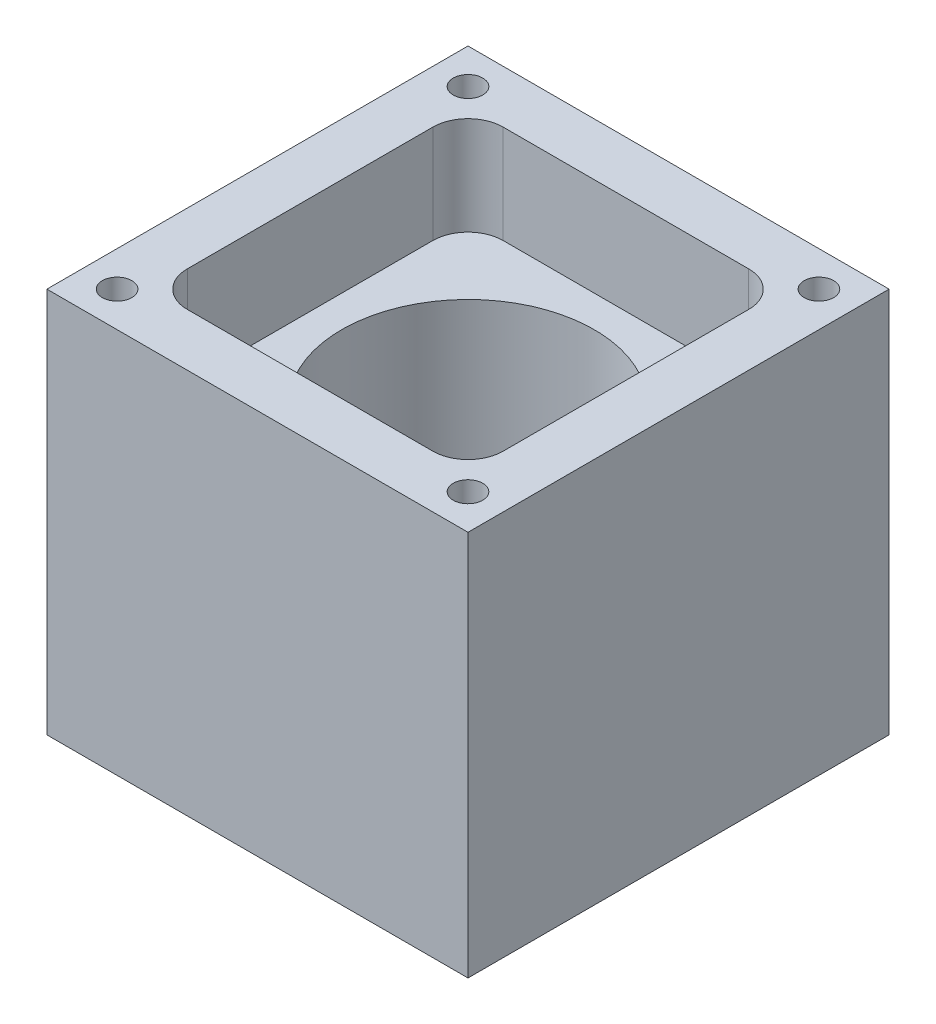
ISO-10303-21;
HEADER;
FILE_DESCRIPTION(('STEP AP214'),'2;1');
FILE_NAME('part.step','',(''),(''),'','','');
FILE_SCHEMA(('AUTOMOTIVE_DESIGN { 1 0 10303 214 1 1 1 1 }'));
ENDSEC;
DATA;
#1=APPLICATION_CONTEXT('core data for automotive mechanical design processes');
#2=APPLICATION_PROTOCOL_DEFINITION('international standard','automotive_design',2000,#1);
#3=PRODUCT_CONTEXT('',#1,'mechanical');
#4=PRODUCT('Part','Part','',(#3));
#5=PRODUCT_RELATED_PRODUCT_CATEGORY('part','',(#4));
#6=PRODUCT_DEFINITION_FORMATION('','',#4);
#7=PRODUCT_DEFINITION_CONTEXT('part definition',#1,'design');
#8=PRODUCT_DEFINITION('design','',#6,#7);
#9=PRODUCT_DEFINITION_SHAPE('','',#8);
#10=(LENGTH_UNIT() NAMED_UNIT(*) SI_UNIT(.MILLI.,.METRE.));
#11=(NAMED_UNIT(*) PLANE_ANGLE_UNIT() SI_UNIT($,.RADIAN.));
#12=(NAMED_UNIT(*) SI_UNIT($,.STERADIAN.) SOLID_ANGLE_UNIT());
#13=UNCERTAINTY_MEASURE_WITH_UNIT(LENGTH_MEASURE(1.E-05),#10,'distance_accuracy_value','');
#14=(GEOMETRIC_REPRESENTATION_CONTEXT(3) GLOBAL_UNCERTAINTY_ASSIGNED_CONTEXT((#13)) GLOBAL_UNIT_ASSIGNED_CONTEXT((#10,
#11,#12)) REPRESENTATION_CONTEXT('',''));
#15=CARTESIAN_POINT('',(0.,0.,0.));
#16=DIRECTION('',(0.,0.,1.));
#17=DIRECTION('',(1.,0.,0.));
#18=AXIS2_PLACEMENT_3D('',#15,#16,#17);
#19=CARTESIAN_POINT('',(0.,0.,0.));
#20=DIRECTION('',(0.,1.,0.));
#21=DIRECTION('',(0.,0.,1.));
#22=AXIS2_PLACEMENT_3D('',#19,#20,#21);
#23=CYLINDRICAL_SURFACE('',#22,18.);
#24=CARTESIAN_POINT('',(0.,0.,0.));
#25=DIRECTION('',(0.,1.,0.));
#26=DIRECTION('',(0.,0.,1.));
#27=AXIS2_PLACEMENT_3D('',#24,#25,#26);
#28=CIRCLE('',#27,18.);
#29=CARTESIAN_POINT('',(0.,0.,18.));
#30=VERTEX_POINT('',#29);
#31=EDGE_CURVE('E257',#30,#30,#28,.T.);
#32=ORIENTED_EDGE('',*,*,#31,.F.);
#33=EDGE_LOOP('',(#32));
#34=FACE_BOUND('',#33,.T.);
#35=CARTESIAN_POINT('',(0.,41.,0.));
#36=DIRECTION('',(0.,1.,0.));
#37=DIRECTION('',(0.,0.,1.));
#38=AXIS2_PLACEMENT_3D('',#35,#36,#37);
#39=CIRCLE('',#38,18.);
#40=CARTESIAN_POINT('',(0.,41.,18.));
#41=VERTEX_POINT('',#40);
#42=EDGE_CURVE('E161',#41,#41,#39,.F.);
#43=ORIENTED_EDGE('',*,*,#42,.F.);
#44=EDGE_LOOP('',(#43));
#45=FACE_BOUND('',#44,.T.);
#46=ADVANCED_FACE('F40',(#34,#45),#23,.F.);
#47=CARTESIAN_POINT('',(-30.,55.,30.));
#48=DIRECTION('',(1.,0.,0.));
#49=DIRECTION('',(0.,0.,-1.));
#50=AXIS2_PLACEMENT_3D('',#47,#48,#49);
#51=PLANE('',#50);
#52=DIRECTION('',(0.,0.,1.));
#53=VECTOR('',#52,1.);
#54=CARTESIAN_POINT('',(-30.,0.,30.));
#55=LINE('',#54,#53);
#56=CARTESIAN_POINT('',(-30.,0.,-30.));
#57=VERTEX_POINT('',#56);
#58=CARTESIAN_POINT('',(-30.,0.,30.));
#59=VERTEX_POINT('',#58);
#60=EDGE_CURVE('E152',#57,#59,#55,.T.);
#61=ORIENTED_EDGE('',*,*,#60,.T.);
#62=DIRECTION('',(0.,-1.,0.));
#63=VECTOR('',#62,1.);
#64=CARTESIAN_POINT('',(-30.,55.,30.));
#65=LINE('',#64,#63);
#66=CARTESIAN_POINT('',(-30.,55.,30.));
#67=VERTEX_POINT('',#66);
#68=EDGE_CURVE('E132',#67,#59,#65,.T.);
#69=ORIENTED_EDGE('',*,*,#68,.F.);
#70=DIRECTION('',(0.,0.,1.));
#71=VECTOR('',#70,1.);
#72=CARTESIAN_POINT('',(-30.,55.,30.));
#73=LINE('',#72,#71);
#74=CARTESIAN_POINT('',(-30.,55.,-30.));
#75=VERTEX_POINT('',#74);
#76=EDGE_CURVE('E139',#75,#67,#73,.T.);
#77=ORIENTED_EDGE('',*,*,#76,.F.);
#78=DIRECTION('',(0.,-1.,0.));
#79=VECTOR('',#78,1.);
#80=CARTESIAN_POINT('',(-30.,55.,-30.));
#81=LINE('',#80,#79);
#82=EDGE_CURVE('E262',#75,#57,#81,.T.);
#83=ORIENTED_EDGE('',*,*,#82,.T.);
#84=EDGE_LOOP('',(#61,#69,#77,#83));
#85=FACE_BOUND('',#84,.T.);
#86=ADVANCED_FACE('F150',(#85),#51,.F.);
#87=CARTESIAN_POINT('',(30.,55.,30.));
#88=DIRECTION('',(0.,0.,-1.));
#89=DIRECTION('',(-1.,0.,0.));
#90=AXIS2_PLACEMENT_3D('',#87,#88,#89);
#91=PLANE('',#90);
#92=DIRECTION('',(1.,0.,0.));
#93=VECTOR('',#92,1.);
#94=CARTESIAN_POINT('',(30.,0.,30.));
#95=LINE('',#94,#93);
#96=CARTESIAN_POINT('',(30.,0.,30.));
#97=VERTEX_POINT('',#96);
#98=EDGE_CURVE('E264',#59,#97,#95,.T.);
#99=ORIENTED_EDGE('',*,*,#98,.T.);
#100=DIRECTION('',(0.,-1.,0.));
#101=VECTOR('',#100,1.);
#102=CARTESIAN_POINT('',(30.,55.,30.));
#103=LINE('',#102,#101);
#104=CARTESIAN_POINT('',(30.,55.,30.));
#105=VERTEX_POINT('',#104);
#106=EDGE_CURVE('E135',#105,#97,#103,.T.);
#107=ORIENTED_EDGE('',*,*,#106,.F.);
#108=DIRECTION('',(1.,0.,0.));
#109=VECTOR('',#108,1.);
#110=CARTESIAN_POINT('',(30.,55.,30.));
#111=LINE('',#110,#109);
#112=EDGE_CURVE('E128',#67,#105,#111,.T.);
#113=ORIENTED_EDGE('',*,*,#112,.F.);
#114=ORIENTED_EDGE('',*,*,#68,.T.);
#115=EDGE_LOOP('',(#99,#107,#113,#114));
#116=FACE_BOUND('',#115,.T.);
#117=ADVANCED_FACE('F130',(#116),#91,.F.);
#118=CARTESIAN_POINT('',(30.,55.,30.));
#119=DIRECTION('',(-1.,0.,0.));
#120=DIRECTION('',(0.,0.,1.));
#121=AXIS2_PLACEMENT_3D('',#118,#119,#120);
#122=PLANE('',#121);
#123=DIRECTION('',(0.,0.,-1.));
#124=VECTOR('',#123,1.);
#125=CARTESIAN_POINT('',(30.,0.,30.));
#126=LINE('',#125,#124);
#127=CARTESIAN_POINT('',(30.,0.,-30.));
#128=VERTEX_POINT('',#127);
#129=EDGE_CURVE('E266',#97,#128,#126,.T.);
#130=ORIENTED_EDGE('',*,*,#129,.T.);
#131=DIRECTION('',(0.,-1.,0.));
#132=VECTOR('',#131,1.);
#133=CARTESIAN_POINT('',(30.,55.,-30.));
#134=LINE('',#133,#132);
#135=CARTESIAN_POINT('',(30.,55.,-30.));
#136=VERTEX_POINT('',#135);
#137=EDGE_CURVE('E157',#136,#128,#134,.T.);
#138=ORIENTED_EDGE('',*,*,#137,.F.);
#139=DIRECTION('',(0.,0.,-1.));
#140=VECTOR('',#139,1.);
#141=CARTESIAN_POINT('',(30.,55.,30.));
#142=LINE('',#141,#140);
#143=EDGE_CURVE('E138',#105,#136,#142,.T.);
#144=ORIENTED_EDGE('',*,*,#143,.F.);
#145=ORIENTED_EDGE('',*,*,#106,.T.);
#146=EDGE_LOOP('',(#130,#138,#144,#145));
#147=FACE_BOUND('',#146,.T.);
#148=ADVANCED_FACE('F278',(#147),#122,.F.);
#149=CARTESIAN_POINT('',(30.,55.,-30.));
#150=DIRECTION('',(0.,0.,1.));
#151=DIRECTION('',(1.,0.,0.));
#152=AXIS2_PLACEMENT_3D('',#149,#150,#151);
#153=PLANE('',#152);
#154=DIRECTION('',(-1.,0.,0.));
#155=VECTOR('',#154,1.);
#156=CARTESIAN_POINT('',(30.,0.,-30.));
#157=LINE('',#156,#155);
#158=EDGE_CURVE('E148',#128,#57,#157,.T.);
#159=ORIENTED_EDGE('',*,*,#158,.T.);
#160=ORIENTED_EDGE('',*,*,#82,.F.);
#161=DIRECTION('',(-1.,0.,0.));
#162=VECTOR('',#161,1.);
#163=CARTESIAN_POINT('',(30.,55.,-30.));
#164=LINE('',#163,#162);
#165=EDGE_CURVE('E144',#136,#75,#164,.T.);
#166=ORIENTED_EDGE('',*,*,#165,.F.);
#167=ORIENTED_EDGE('',*,*,#137,.T.);
#168=EDGE_LOOP('',(#159,#160,#166,#167));
#169=FACE_BOUND('',#168,.T.);
#170=ADVANCED_FACE('F273',(#169),#153,.F.);
#171=CARTESIAN_POINT('',(0.,55.,0.));
#172=DIRECTION('',(0.,1.,0.));
#173=DIRECTION('',(0.,0.,1.));
#174=AXIS2_PLACEMENT_3D('',#171,#172,#173);
#175=PLANE('',#174);
#176=DIRECTION('',(0.,0.,1.));
#177=VECTOR('',#176,1.);
#178=CARTESIAN_POINT('',(-22.5,55.,22.5));
#179=LINE('',#178,#177);
#180=CARTESIAN_POINT('',(-22.5,55.,-17.5));
#181=VERTEX_POINT('',#180);
#182=CARTESIAN_POINT('',(-22.5,55.,17.5));
#183=VERTEX_POINT('',#182);
#184=EDGE_CURVE('E207',#181,#183,#179,.T.);
#185=ORIENTED_EDGE('',*,*,#184,.F.);
#186=CARTESIAN_POINT('',(-17.5,55.,-17.5));
#187=DIRECTION('',(0.,1.,0.));
#188=DIRECTION('',(0.,0.,1.));
#189=AXIS2_PLACEMENT_3D('',#186,#187,#188);
#190=CIRCLE('',#189,5.);
#191=CARTESIAN_POINT('',(-17.5,55.,-22.5));
#192=VERTEX_POINT('',#191);
#193=EDGE_CURVE('E11',#181,#192,#190,.F.);
#194=ORIENTED_EDGE('',*,*,#193,.T.);
#195=DIRECTION('',(-1.,0.,0.));
#196=VECTOR('',#195,1.);
#197=CARTESIAN_POINT('',(22.5,55.,-22.5));
#198=LINE('',#197,#196);
#199=CARTESIAN_POINT('',(17.5,55.,-22.5));
#200=VERTEX_POINT('',#199);
#201=EDGE_CURVE('E231',#200,#192,#198,.T.);
#202=ORIENTED_EDGE('',*,*,#201,.F.);
#203=CARTESIAN_POINT('',(17.5,55.,-17.5));
#204=DIRECTION('',(0.,1.,0.));
#205=DIRECTION('',(0.,0.,1.));
#206=AXIS2_PLACEMENT_3D('',#203,#204,#205);
#207=CIRCLE('',#206,5.);
#208=CARTESIAN_POINT('',(22.5,55.,-17.5));
#209=VERTEX_POINT('',#208);
#210=EDGE_CURVE('E190',#200,#209,#207,.F.);
#211=ORIENTED_EDGE('',*,*,#210,.T.);
#212=DIRECTION('',(0.,0.,-1.));
#213=VECTOR('',#212,1.);
#214=CARTESIAN_POINT('',(22.5,55.,22.5));
#215=LINE('',#214,#213);
#216=CARTESIAN_POINT('',(22.5,55.,17.5));
#217=VERTEX_POINT('',#216);
#218=EDGE_CURVE('E198',#217,#209,#215,.T.);
#219=ORIENTED_EDGE('',*,*,#218,.F.);
#220=CARTESIAN_POINT('',(17.5,55.,17.5));
#221=DIRECTION('',(0.,1.,0.));
#222=DIRECTION('',(0.,0.,1.));
#223=AXIS2_PLACEMENT_3D('',#220,#221,#222);
#224=CIRCLE('',#223,5.);
#225=CARTESIAN_POINT('',(17.5,55.,22.5));
#226=VERTEX_POINT('',#225);
#227=EDGE_CURVE('E192',#217,#226,#224,.F.);
#228=ORIENTED_EDGE('',*,*,#227,.T.);
#229=DIRECTION('',(1.,0.,0.));
#230=VECTOR('',#229,1.);
#231=CARTESIAN_POINT('',(22.5,55.,22.5));
#232=LINE('',#231,#230);
#233=CARTESIAN_POINT('',(-17.5,55.,22.5));
#234=VERTEX_POINT('',#233);
#235=EDGE_CURVE('E196',#234,#226,#232,.T.);
#236=ORIENTED_EDGE('',*,*,#235,.F.);
#237=CARTESIAN_POINT('',(-17.5,55.,17.5));
#238=DIRECTION('',(0.,1.,0.));
#239=DIRECTION('',(0.,0.,1.));
#240=AXIS2_PLACEMENT_3D('',#237,#238,#239);
#241=CIRCLE('',#240,5.);
#242=EDGE_CURVE('E48',#234,#183,#241,.F.);
#243=ORIENTED_EDGE('',*,*,#242,.T.);
#244=EDGE_LOOP('',(#185,#194,#202,#211,#219,#228,#236,#243));
#245=FACE_BOUND('',#244,.T.);
#246=CARTESIAN_POINT('',(-25.,55.,25.));
#247=DIRECTION('',(0.,1.,0.));
#248=DIRECTION('',(0.,0.,1.));
#249=AXIS2_PLACEMENT_3D('',#246,#247,#248);
#250=CIRCLE('',#249,2.09999999999999);
#251=CARTESIAN_POINT('',(-25.,55.,27.1));
#252=VERTEX_POINT('',#251);
#253=EDGE_CURVE('E163',#252,#252,#250,.T.);
#254=ORIENTED_EDGE('',*,*,#253,.F.);
#255=EDGE_LOOP('',(#254));
#256=FACE_BOUND('',#255,.T.);
#257=CARTESIAN_POINT('',(-25.,55.,-25.));
#258=DIRECTION('',(0.,1.,0.));
#259=DIRECTION('',(0.,0.,1.));
#260=AXIS2_PLACEMENT_3D('',#257,#258,#259);
#261=CIRCLE('',#260,2.09999999999999);
#262=CARTESIAN_POINT('',(-25.,55.,-22.9));
#263=VERTEX_POINT('',#262);
#264=EDGE_CURVE('E239',#263,#263,#261,.T.);
#265=ORIENTED_EDGE('',*,*,#264,.F.);
#266=EDGE_LOOP('',(#265));
#267=FACE_BOUND('',#266,.T.);
#268=CARTESIAN_POINT('',(25.,55.,-25.));
#269=DIRECTION('',(0.,1.,0.));
#270=DIRECTION('',(0.,0.,1.));
#271=AXIS2_PLACEMENT_3D('',#268,#269,#270);
#272=CIRCLE('',#271,2.09999999999999);
#273=CARTESIAN_POINT('',(25.,55.,-22.9));
#274=VERTEX_POINT('',#273);
#275=EDGE_CURVE('E245',#274,#274,#272,.T.);
#276=ORIENTED_EDGE('',*,*,#275,.F.);
#277=EDGE_LOOP('',(#276));
#278=FACE_BOUND('',#277,.T.);
#279=CARTESIAN_POINT('',(25.,55.,25.));
#280=DIRECTION('',(0.,1.,0.));
#281=DIRECTION('',(0.,0.,1.));
#282=AXIS2_PLACEMENT_3D('',#279,#280,#281);
#283=CIRCLE('',#282,2.09999999999999);
#284=CARTESIAN_POINT('',(25.,55.,27.1));
#285=VERTEX_POINT('',#284);
#286=EDGE_CURVE('E251',#285,#285,#283,.T.);
#287=ORIENTED_EDGE('',*,*,#286,.F.);
#288=EDGE_LOOP('',(#287));
#289=FACE_BOUND('',#288,.T.);
#290=ORIENTED_EDGE('',*,*,#76,.T.);
#291=ORIENTED_EDGE('',*,*,#112,.T.);
#292=ORIENTED_EDGE('',*,*,#143,.T.);
#293=ORIENTED_EDGE('',*,*,#165,.T.);
#294=EDGE_LOOP('',(#290,#291,#292,#293));
#295=FACE_BOUND('',#294,.T.);
#296=ADVANCED_FACE('F142',(#245,#256,#267,#278,#289,#295),#175,.T.);
#297=CARTESIAN_POINT('',(0.,0.,0.));
#298=DIRECTION('',(0.,1.,0.));
#299=DIRECTION('',(0.,0.,1.));
#300=AXIS2_PLACEMENT_3D('',#297,#298,#299);
#301=PLANE('',#300);
#302=CARTESIAN_POINT('',(-25.,0.,25.));
#303=DIRECTION('',(0.,1.,0.));
#304=DIRECTION('',(0.,0.,1.));
#305=AXIS2_PLACEMENT_3D('',#302,#303,#304);
#306=CIRCLE('',#305,2.09999999999999);
#307=CARTESIAN_POINT('',(-25.,0.,27.1));
#308=VERTEX_POINT('',#307);
#309=EDGE_CURVE('E236',#308,#308,#306,.T.);
#310=ORIENTED_EDGE('',*,*,#309,.T.);
#311=EDGE_LOOP('',(#310));
#312=FACE_BOUND('',#311,.T.);
#313=CARTESIAN_POINT('',(-25.,0.,-25.));
#314=DIRECTION('',(0.,1.,0.));
#315=DIRECTION('',(0.,0.,1.));
#316=AXIS2_PLACEMENT_3D('',#313,#314,#315);
#317=CIRCLE('',#316,2.09999999999999);
#318=CARTESIAN_POINT('',(-25.,0.,-22.9));
#319=VERTEX_POINT('',#318);
#320=EDGE_CURVE('E242',#319,#319,#317,.T.);
#321=ORIENTED_EDGE('',*,*,#320,.T.);
#322=EDGE_LOOP('',(#321));
#323=FACE_BOUND('',#322,.T.);
#324=CARTESIAN_POINT('',(25.,0.,-25.));
#325=DIRECTION('',(0.,1.,0.));
#326=DIRECTION('',(0.,0.,1.));
#327=AXIS2_PLACEMENT_3D('',#324,#325,#326);
#328=CIRCLE('',#327,2.09999999999999);
#329=CARTESIAN_POINT('',(25.,0.,-22.9));
#330=VERTEX_POINT('',#329);
#331=EDGE_CURVE('E248',#330,#330,#328,.T.);
#332=ORIENTED_EDGE('',*,*,#331,.T.);
#333=EDGE_LOOP('',(#332));
#334=FACE_BOUND('',#333,.T.);
#335=CARTESIAN_POINT('',(25.,0.,25.));
#336=DIRECTION('',(0.,1.,0.));
#337=DIRECTION('',(0.,0.,1.));
#338=AXIS2_PLACEMENT_3D('',#335,#336,#337);
#339=CIRCLE('',#338,2.09999999999999);
#340=CARTESIAN_POINT('',(25.,0.,27.1));
#341=VERTEX_POINT('',#340);
#342=EDGE_CURVE('E254',#341,#341,#339,.T.);
#343=ORIENTED_EDGE('',*,*,#342,.T.);
#344=EDGE_LOOP('',(#343));
#345=FACE_BOUND('',#344,.T.);
#346=ORIENTED_EDGE('',*,*,#31,.T.);
#347=EDGE_LOOP('',(#346));
#348=FACE_BOUND('',#347,.T.);
#349=ORIENTED_EDGE('',*,*,#60,.F.);
#350=ORIENTED_EDGE('',*,*,#158,.F.);
#351=ORIENTED_EDGE('',*,*,#129,.F.);
#352=ORIENTED_EDGE('',*,*,#98,.F.);
#353=EDGE_LOOP('',(#349,#350,#351,#352));
#354=FACE_BOUND('',#353,.T.);
#355=ADVANCED_FACE('F277',(#312,#323,#334,#345,#348,#354),#301,.F.);
#356=CARTESIAN_POINT('',(25.,55.,25.));
#357=DIRECTION('',(0.,1.,0.));
#358=DIRECTION('',(0.,0.,1.));
#359=AXIS2_PLACEMENT_3D('',#356,#357,#358);
#360=CYLINDRICAL_SURFACE('',#359,2.09999999999999);
#361=ORIENTED_EDGE('',*,*,#342,.F.);
#362=EDGE_LOOP('',(#361));
#363=FACE_BOUND('',#362,.T.);
#364=ORIENTED_EDGE('',*,*,#286,.T.);
#365=EDGE_LOOP('',(#364));
#366=FACE_BOUND('',#365,.T.);
#367=ADVANCED_FACE('F298',(#363,#366),#360,.F.);
#368=CARTESIAN_POINT('',(25.,55.,-25.));
#369=DIRECTION('',(0.,1.,0.));
#370=DIRECTION('',(0.,0.,1.));
#371=AXIS2_PLACEMENT_3D('',#368,#369,#370);
#372=CYLINDRICAL_SURFACE('',#371,2.09999999999999);
#373=ORIENTED_EDGE('',*,*,#331,.F.);
#374=EDGE_LOOP('',(#373));
#375=FACE_BOUND('',#374,.T.);
#376=ORIENTED_EDGE('',*,*,#275,.T.);
#377=EDGE_LOOP('',(#376));
#378=FACE_BOUND('',#377,.T.);
#379=ADVANCED_FACE('F307',(#375,#378),#372,.F.);
#380=CARTESIAN_POINT('',(-25.,55.,-25.));
#381=DIRECTION('',(0.,1.,0.));
#382=DIRECTION('',(0.,0.,1.));
#383=AXIS2_PLACEMENT_3D('',#380,#381,#382);
#384=CYLINDRICAL_SURFACE('',#383,2.09999999999999);
#385=ORIENTED_EDGE('',*,*,#320,.F.);
#386=EDGE_LOOP('',(#385));
#387=FACE_BOUND('',#386,.T.);
#388=ORIENTED_EDGE('',*,*,#264,.T.);
#389=EDGE_LOOP('',(#388));
#390=FACE_BOUND('',#389,.T.);
#391=ADVANCED_FACE('F323',(#387,#390),#384,.F.);
#392=CARTESIAN_POINT('',(-25.,55.,25.));
#393=DIRECTION('',(0.,1.,0.));
#394=DIRECTION('',(0.,0.,1.));
#395=AXIS2_PLACEMENT_3D('',#392,#393,#394);
#396=CYLINDRICAL_SURFACE('',#395,2.09999999999999);
#397=ORIENTED_EDGE('',*,*,#309,.F.);
#398=EDGE_LOOP('',(#397));
#399=FACE_BOUND('',#398,.T.);
#400=ORIENTED_EDGE('',*,*,#253,.T.);
#401=EDGE_LOOP('',(#400));
#402=FACE_BOUND('',#401,.T.);
#403=ADVANCED_FACE('F329',(#399,#402),#396,.F.);
#404=CARTESIAN_POINT('',(0.,41.,0.));
#405=DIRECTION('',(0.,1.,0.));
#406=DIRECTION('',(0.,0.,1.));
#407=AXIS2_PLACEMENT_3D('',#404,#405,#406);
#408=PLANE('',#407);
#409=DIRECTION('',(0.,0.,-1.));
#410=VECTOR('',#409,1.);
#411=CARTESIAN_POINT('',(22.5,41.,22.5));
#412=LINE('',#411,#410);
#413=CARTESIAN_POINT('',(22.5,41.,17.5));
#414=VERTEX_POINT('',#413);
#415=CARTESIAN_POINT('',(22.5,41.,-17.5));
#416=VERTEX_POINT('',#415);
#417=EDGE_CURVE('E216',#414,#416,#412,.T.);
#418=ORIENTED_EDGE('',*,*,#417,.T.);
#419=CARTESIAN_POINT('',(17.5,41.,-17.5));
#420=DIRECTION('',(0.,1.,0.));
#421=DIRECTION('',(0.,0.,1.));
#422=AXIS2_PLACEMENT_3D('',#419,#420,#421);
#423=CIRCLE('',#422,5.);
#424=CARTESIAN_POINT('',(17.5,41.,-22.5));
#425=VERTEX_POINT('',#424);
#426=EDGE_CURVE('E179',#416,#425,#423,.T.);
#427=ORIENTED_EDGE('',*,*,#426,.T.);
#428=DIRECTION('',(-1.,0.,0.));
#429=VECTOR('',#428,1.);
#430=CARTESIAN_POINT('',(22.5,41.,-22.5));
#431=LINE('',#430,#429);
#432=CARTESIAN_POINT('',(-17.5,41.,-22.5));
#433=VERTEX_POINT('',#432);
#434=EDGE_CURVE('E164',#425,#433,#431,.T.);
#435=ORIENTED_EDGE('',*,*,#434,.T.);
#436=CARTESIAN_POINT('',(-17.5,41.,-17.5));
#437=DIRECTION('',(0.,1.,0.));
#438=DIRECTION('',(0.,0.,1.));
#439=AXIS2_PLACEMENT_3D('',#436,#437,#438);
#440=CIRCLE('',#439,5.);
#441=CARTESIAN_POINT('',(-22.5,41.,-17.5));
#442=VERTEX_POINT('',#441);
#443=EDGE_CURVE('E173',#433,#442,#440,.T.);
#444=ORIENTED_EDGE('',*,*,#443,.T.);
#445=DIRECTION('',(0.,0.,1.));
#446=VECTOR('',#445,1.);
#447=CARTESIAN_POINT('',(-22.5,41.,22.5));
#448=LINE('',#447,#446);
#449=CARTESIAN_POINT('',(-22.5,41.,17.5));
#450=VERTEX_POINT('',#449);
#451=EDGE_CURVE('E225',#442,#450,#448,.T.);
#452=ORIENTED_EDGE('',*,*,#451,.T.);
#453=CARTESIAN_POINT('',(-17.5,41.,17.5));
#454=DIRECTION('',(0.,1.,0.));
#455=DIRECTION('',(0.,0.,1.));
#456=AXIS2_PLACEMENT_3D('',#453,#454,#455);
#457=CIRCLE('',#456,5.);
#458=CARTESIAN_POINT('',(-17.5,41.,22.5));
#459=VERTEX_POINT('',#458);
#460=EDGE_CURVE('E175',#450,#459,#457,.T.);
#461=ORIENTED_EDGE('',*,*,#460,.T.);
#462=DIRECTION('',(1.,0.,0.));
#463=VECTOR('',#462,1.);
#464=CARTESIAN_POINT('',(22.5,41.,22.5));
#465=LINE('',#464,#463);
#466=CARTESIAN_POINT('',(17.5,41.,22.5));
#467=VERTEX_POINT('',#466);
#468=EDGE_CURVE('E218',#459,#467,#465,.T.);
#469=ORIENTED_EDGE('',*,*,#468,.T.);
#470=CARTESIAN_POINT('',(17.5,41.,17.5));
#471=DIRECTION('',(0.,1.,0.));
#472=DIRECTION('',(0.,0.,1.));
#473=AXIS2_PLACEMENT_3D('',#470,#471,#472);
#474=CIRCLE('',#473,5.);
#475=EDGE_CURVE('E177',#467,#414,#474,.T.);
#476=ORIENTED_EDGE('',*,*,#475,.T.);
#477=EDGE_LOOP('',(#418,#427,#435,#444,#452,#461,#469,#476));
#478=FACE_BOUND('',#477,.T.);
#479=ORIENTED_EDGE('',*,*,#42,.T.);
#480=EDGE_LOOP('',(#479));
#481=FACE_BOUND('',#480,.T.);
#482=ADVANCED_FACE('F214',(#478,#481),#408,.T.);
#483=CARTESIAN_POINT('',(-22.5,41.,22.5));
#484=DIRECTION('',(-1.,0.,0.));
#485=DIRECTION('',(0.,0.,1.));
#486=AXIS2_PLACEMENT_3D('',#483,#484,#485);
#487=PLANE('',#486);
#488=ORIENTED_EDGE('',*,*,#184,.T.);
#489=DIRECTION('',(0.,1.,0.));
#490=VECTOR('',#489,1.);
#491=CARTESIAN_POINT('',(-22.5,41.,17.5));
#492=LINE('',#491,#490);
#493=EDGE_CURVE('E188',#183,#450,#492,.F.);
#494=ORIENTED_EDGE('',*,*,#493,.T.);
#495=ORIENTED_EDGE('',*,*,#451,.F.);
#496=DIRECTION('',(0.,1.,0.));
#497=VECTOR('',#496,1.);
#498=CARTESIAN_POINT('',(-22.5,55.,-17.5));
#499=LINE('',#498,#497);
#500=EDGE_CURVE('E186',#442,#181,#499,.T.);
#501=ORIENTED_EDGE('',*,*,#500,.T.);
#502=EDGE_LOOP('',(#488,#494,#495,#501));
#503=FACE_BOUND('',#502,.T.);
#504=ADVANCED_FACE('F336',(#503),#487,.F.);
#505=CARTESIAN_POINT('',(22.5,41.,-22.5));
#506=DIRECTION('',(0.,0.,-1.));
#507=DIRECTION('',(-1.,0.,0.));
#508=AXIS2_PLACEMENT_3D('',#505,#506,#507);
#509=PLANE('',#508);
#510=ORIENTED_EDGE('',*,*,#434,.F.);
#511=DIRECTION('',(0.,1.,0.));
#512=VECTOR('',#511,1.);
#513=CARTESIAN_POINT('',(17.5,55.,-22.5));
#514=LINE('',#513,#512);
#515=EDGE_CURVE('E155',#425,#200,#514,.T.);
#516=ORIENTED_EDGE('',*,*,#515,.T.);
#517=ORIENTED_EDGE('',*,*,#201,.T.);
#518=DIRECTION('',(0.,1.,0.));
#519=VECTOR('',#518,1.);
#520=CARTESIAN_POINT('',(-17.5,41.,-22.5));
#521=LINE('',#520,#519);
#522=EDGE_CURVE('E153',#192,#433,#521,.F.);
#523=ORIENTED_EDGE('',*,*,#522,.T.);
#524=EDGE_LOOP('',(#510,#516,#517,#523));
#525=FACE_BOUND('',#524,.T.);
#526=ADVANCED_FACE('F339',(#525),#509,.F.);
#527=CARTESIAN_POINT('',(22.5,41.,22.5));
#528=DIRECTION('',(1.,0.,0.));
#529=DIRECTION('',(0.,0.,-1.));
#530=AXIS2_PLACEMENT_3D('',#527,#528,#529);
#531=PLANE('',#530);
#532=ORIENTED_EDGE('',*,*,#218,.T.);
#533=DIRECTION('',(0.,1.,0.));
#534=VECTOR('',#533,1.);
#535=CARTESIAN_POINT('',(22.5,41.,-17.5));
#536=LINE('',#535,#534);
#537=EDGE_CURVE('E171',#209,#416,#536,.F.);
#538=ORIENTED_EDGE('',*,*,#537,.T.);
#539=ORIENTED_EDGE('',*,*,#417,.F.);
#540=DIRECTION('',(0.,1.,0.));
#541=VECTOR('',#540,1.);
#542=CARTESIAN_POINT('',(22.5,55.,17.5));
#543=LINE('',#542,#541);
#544=EDGE_CURVE('E168',#414,#217,#543,.T.);
#545=ORIENTED_EDGE('',*,*,#544,.T.);
#546=EDGE_LOOP('',(#532,#538,#539,#545));
#547=FACE_BOUND('',#546,.T.);
#548=ADVANCED_FACE('F220',(#547),#531,.F.);
#549=CARTESIAN_POINT('',(22.5,41.,22.5));
#550=DIRECTION('',(0.,0.,1.));
#551=DIRECTION('',(1.,0.,0.));
#552=AXIS2_PLACEMENT_3D('',#549,#550,#551);
#553=PLANE('',#552);
#554=ORIENTED_EDGE('',*,*,#235,.T.);
#555=DIRECTION('',(0.,1.,0.));
#556=VECTOR('',#555,1.);
#557=CARTESIAN_POINT('',(17.5,41.,22.5));
#558=LINE('',#557,#556);
#559=EDGE_CURVE('E184',#226,#467,#558,.F.);
#560=ORIENTED_EDGE('',*,*,#559,.T.);
#561=ORIENTED_EDGE('',*,*,#468,.F.);
#562=DIRECTION('',(0.,1.,0.));
#563=VECTOR('',#562,1.);
#564=CARTESIAN_POINT('',(-17.5,55.,22.5));
#565=LINE('',#564,#563);
#566=EDGE_CURVE('E181',#459,#234,#565,.T.);
#567=ORIENTED_EDGE('',*,*,#566,.T.);
#568=EDGE_LOOP('',(#554,#560,#561,#567));
#569=FACE_BOUND('',#568,.T.);
#570=ADVANCED_FACE('F203',(#569),#553,.F.);
#571=CARTESIAN_POINT('',(17.5,41.,-17.5));
#572=DIRECTION('',(0.,-1.,0.));
#573=DIRECTION('',(0.,0.,-1.));
#574=AXIS2_PLACEMENT_3D('',#571,#572,#573);
#575=CYLINDRICAL_SURFACE('',#574,5.);
#576=ORIENTED_EDGE('',*,*,#426,.F.);
#577=ORIENTED_EDGE('',*,*,#537,.F.);
#578=ORIENTED_EDGE('',*,*,#210,.F.);
#579=ORIENTED_EDGE('',*,*,#515,.F.);
#580=EDGE_LOOP('',(#576,#577,#578,#579));
#581=FACE_BOUND('',#580,.T.);
#582=ADVANCED_FACE('F343',(#581),#575,.F.);
#583=CARTESIAN_POINT('',(17.5,41.,17.5));
#584=DIRECTION('',(0.,-1.,0.));
#585=DIRECTION('',(0.,0.,-1.));
#586=AXIS2_PLACEMENT_3D('',#583,#584,#585);
#587=CYLINDRICAL_SURFACE('',#586,5.);
#588=ORIENTED_EDGE('',*,*,#475,.F.);
#589=ORIENTED_EDGE('',*,*,#559,.F.);
#590=ORIENTED_EDGE('',*,*,#227,.F.);
#591=ORIENTED_EDGE('',*,*,#544,.F.);
#592=EDGE_LOOP('',(#588,#589,#590,#591));
#593=FACE_BOUND('',#592,.T.);
#594=ADVANCED_FACE('F210',(#593),#587,.F.);
#595=CARTESIAN_POINT('',(-17.5,41.,17.5));
#596=DIRECTION('',(0.,-1.,0.));
#597=DIRECTION('',(0.,0.,-1.));
#598=AXIS2_PLACEMENT_3D('',#595,#596,#597);
#599=CYLINDRICAL_SURFACE('',#598,5.);
#600=ORIENTED_EDGE('',*,*,#460,.F.);
#601=ORIENTED_EDGE('',*,*,#493,.F.);
#602=ORIENTED_EDGE('',*,*,#242,.F.);
#603=ORIENTED_EDGE('',*,*,#566,.F.);
#604=EDGE_LOOP('',(#600,#601,#602,#603));
#605=FACE_BOUND('',#604,.T.);
#606=ADVANCED_FACE('F383',(#605),#599,.F.);
#607=CARTESIAN_POINT('',(-17.5,41.,-17.5));
#608=DIRECTION('',(0.,-1.,0.));
#609=DIRECTION('',(0.,0.,-1.));
#610=AXIS2_PLACEMENT_3D('',#607,#608,#609);
#611=CYLINDRICAL_SURFACE('',#610,5.);
#612=ORIENTED_EDGE('',*,*,#443,.F.);
#613=ORIENTED_EDGE('',*,*,#522,.F.);
#614=ORIENTED_EDGE('',*,*,#193,.F.);
#615=ORIENTED_EDGE('',*,*,#500,.F.);
#616=EDGE_LOOP('',(#612,#613,#614,#615));
#617=FACE_BOUND('',#616,.T.);
#618=ADVANCED_FACE('F42',(#617),#611,.F.);
#619=CLOSED_SHELL('',(#46,#86,#117,#148,#170,#296,#355,#367,#379,#391,#403,#482,#504,#526,#548,
#570,#582,#594,#606,#618));
#620=MANIFOLD_SOLID_BREP('B2',#619);
#621=ADVANCED_BREP_SHAPE_REPRESENTATION('',(#18,#620),#14);
#622=SHAPE_DEFINITION_REPRESENTATION(#9,#621);
ENDSEC;
END-ISO-10303-21;
